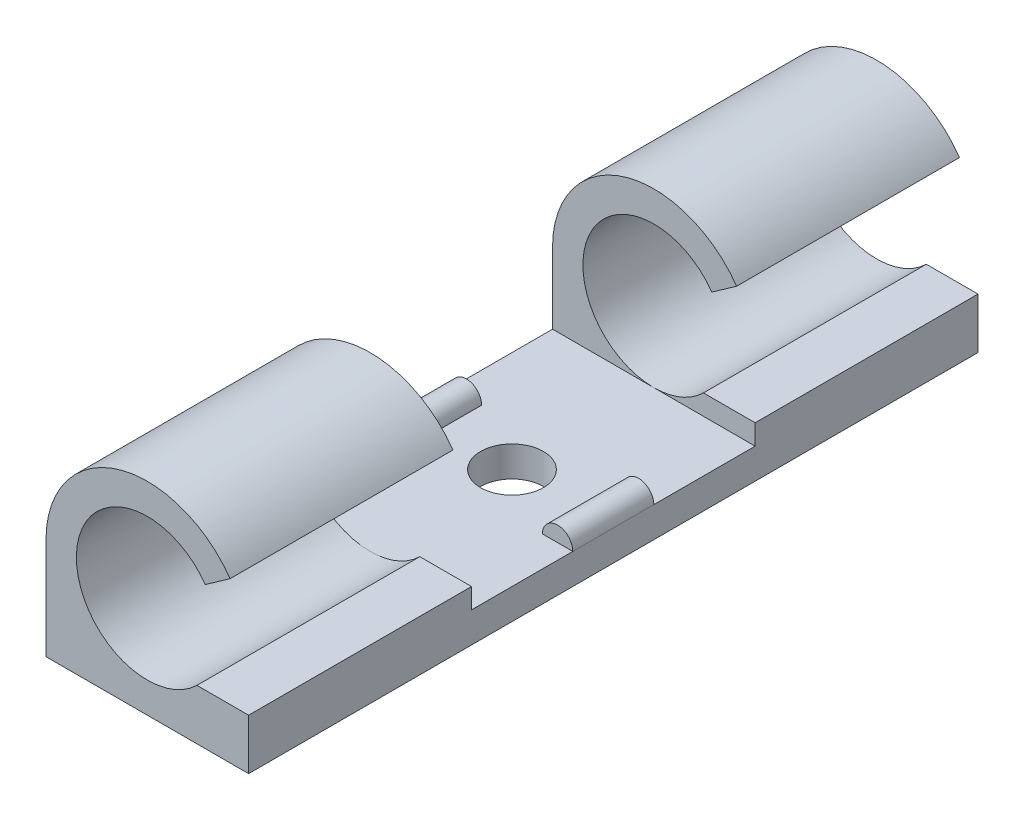
ISO-10303-21;
HEADER;
FILE_DESCRIPTION(('STEP AP214'),'2;1');
FILE_NAME('part.step','',(''),(''),'','','');
FILE_SCHEMA(('AUTOMOTIVE_DESIGN { 1 0 10303 214 1 1 1 1 }'));
ENDSEC;
DATA;
#1=APPLICATION_CONTEXT('core data for automotive mechanical design processes');
#2=APPLICATION_PROTOCOL_DEFINITION('international standard','automotive_design',2000,#1);
#3=PRODUCT_CONTEXT('',#1,'mechanical');
#4=PRODUCT('Part','Part','',(#3));
#5=PRODUCT_RELATED_PRODUCT_CATEGORY('part','',(#4));
#6=PRODUCT_DEFINITION_FORMATION('','',#4);
#7=PRODUCT_DEFINITION_CONTEXT('part definition',#1,'design');
#8=PRODUCT_DEFINITION('design','',#6,#7);
#9=PRODUCT_DEFINITION_SHAPE('','',#8);
#10=(LENGTH_UNIT() NAMED_UNIT(*) SI_UNIT(.MILLI.,.METRE.));
#11=(NAMED_UNIT(*) PLANE_ANGLE_UNIT() SI_UNIT($,.RADIAN.));
#12=(NAMED_UNIT(*) SI_UNIT($,.STERADIAN.) SOLID_ANGLE_UNIT());
#13=UNCERTAINTY_MEASURE_WITH_UNIT(LENGTH_MEASURE(1.E-05),#10,'distance_accuracy_value','');
#14=(GEOMETRIC_REPRESENTATION_CONTEXT(3) GLOBAL_UNCERTAINTY_ASSIGNED_CONTEXT((#13)) GLOBAL_UNIT_ASSIGNED_CONTEXT((#10,
#11,#12)) REPRESENTATION_CONTEXT('',''));
#15=CARTESIAN_POINT('',(0.,0.,0.));
#16=DIRECTION('',(0.,0.,1.));
#17=DIRECTION('',(1.,0.,0.));
#18=AXIS2_PLACEMENT_3D('',#15,#16,#17);
#19=CARTESIAN_POINT('',(5.,0.,11.));
#20=DIRECTION('',(1.,0.,0.));
#21=DIRECTION('',(0.,0.,-1.));
#22=AXIS2_PLACEMENT_3D('',#19,#20,#21);
#23=PLANE('',#22);
#24=DIRECTION('',(0.,-1.,0.));
#25=VECTOR('',#24,1.);
#26=CARTESIAN_POINT('',(5.,0.,0.));
#27=LINE('',#26,#25);
#28=CARTESIAN_POINT('',(5.,-2.5,0.));
#29=VERTEX_POINT('',#28);
#30=CARTESIAN_POINT('',(5.,-5.,0.));
#31=VERTEX_POINT('',#30);
#32=EDGE_CURVE('E200',#29,#31,#27,.T.);
#33=ORIENTED_EDGE('',*,*,#32,.F.);
#34=DIRECTION('',(0.,0.,1.));
#35=VECTOR('',#34,1.);
#36=CARTESIAN_POINT('',(5.,-2.5,0.));
#37=LINE('',#36,#35);
#38=CARTESIAN_POINT('',(5.,-2.5,11.));
#39=VERTEX_POINT('',#38);
#40=EDGE_CURVE('E61',#29,#39,#37,.T.);
#41=ORIENTED_EDGE('',*,*,#40,.T.);
#42=DIRECTION('',(0.,-1.,0.));
#43=VECTOR('',#42,1.);
#44=CARTESIAN_POINT('',(5.,0.,11.));
#45=LINE('',#44,#43);
#46=CARTESIAN_POINT('',(5.,-3.5,11.));
#47=VERTEX_POINT('',#46);
#48=EDGE_CURVE('E330',#39,#47,#45,.T.);
#49=ORIENTED_EDGE('',*,*,#48,.T.);
#50=DIRECTION('',(0.,0.,-1.));
#51=VECTOR('',#50,1.);
#52=CARTESIAN_POINT('',(5.,-3.5,18.));
#53=LINE('',#52,#51);
#54=CARTESIAN_POINT('',(5.,-3.5,16.));
#55=VERTEX_POINT('',#54);
#56=EDGE_CURVE('E202',#55,#47,#53,.T.);
#57=ORIENTED_EDGE('',*,*,#56,.F.);
#58=CARTESIAN_POINT('',(5.,-3.5,20.));
#59=VERTEX_POINT('',#58);
#60=EDGE_CURVE('E197',#59,#55,#53,.T.);
#61=ORIENTED_EDGE('',*,*,#60,.F.);
#62=DIRECTION('',(0.,0.,1.));
#63=VECTOR('',#62,1.);
#64=CARTESIAN_POINT('',(5.,-3.5,18.));
#65=LINE('',#64,#63);
#66=CARTESIAN_POINT('',(5.,-3.5,25.));
#67=VERTEX_POINT('',#66);
#68=EDGE_CURVE('E285',#59,#67,#65,.T.);
#69=ORIENTED_EDGE('',*,*,#68,.T.);
#70=DIRECTION('',(0.,-1.,0.));
#71=VECTOR('',#70,1.);
#72=CARTESIAN_POINT('',(5.,0.,25.));
#73=LINE('',#72,#71);
#74=CARTESIAN_POINT('',(5.,-2.5,25.));
#75=VERTEX_POINT('',#74);
#76=EDGE_CURVE('E292',#75,#67,#73,.T.);
#77=ORIENTED_EDGE('',*,*,#76,.F.);
#78=CARTESIAN_POINT('',(5.,-2.5,36.));
#79=VERTEX_POINT('',#78);
#80=EDGE_CURVE('E191',#75,#79,#37,.T.);
#81=ORIENTED_EDGE('',*,*,#80,.T.);
#82=DIRECTION('',(0.,-1.,0.));
#83=VECTOR('',#82,1.);
#84=CARTESIAN_POINT('',(5.,0.,36.));
#85=LINE('',#84,#83);
#86=CARTESIAN_POINT('',(5.,-5.,36.));
#87=VERTEX_POINT('',#86);
#88=EDGE_CURVE('E224',#79,#87,#85,.T.);
#89=ORIENTED_EDGE('',*,*,#88,.T.);
#90=DIRECTION('',(0.,0.,-1.));
#91=VECTOR('',#90,1.);
#92=CARTESIAN_POINT('',(5.,-5.,11.));
#93=LINE('',#92,#91);
#94=EDGE_CURVE('E52',#87,#31,#93,.T.);
#95=ORIENTED_EDGE('',*,*,#94,.T.);
#96=EDGE_LOOP('',(#33,#41,#49,#57,#61,#69,#77,#81,#89,#95));
#97=FACE_BOUND('',#96,.T.);
#98=ADVANCED_FACE('F43',(#97),#23,.T.);
#99=CARTESIAN_POINT('',(0.,0.,11.));
#100=DIRECTION('',(0.,0.,-1.));
#101=DIRECTION('',(-1.,0.,0.));
#102=AXIS2_PLACEMENT_3D('',#99,#100,#101);
#103=CYLINDRICAL_SURFACE('',#102,5.);
#104=DIRECTION('',(0.,0.,1.));
#105=VECTOR('',#104,1.);
#106=CARTESIAN_POINT('',(4.08754779922108,2.87957514037798,0.));
#107=LINE('',#106,#105);
#108=CARTESIAN_POINT('',(4.08754779922108,2.87957514037798,0.));
#109=VERTEX_POINT('',#108);
#110=CARTESIAN_POINT('',(4.08754779922108,2.87957514037798,11.));
#111=VERTEX_POINT('',#110);
#112=EDGE_CURVE('E243',#109,#111,#107,.T.);
#113=ORIENTED_EDGE('',*,*,#112,.F.);
#114=CARTESIAN_POINT('',(0.,0.,0.));
#115=DIRECTION('',(0.,0.,1.));
#116=DIRECTION('',(1.,0.,0.));
#117=AXIS2_PLACEMENT_3D('',#114,#115,#116);
#118=CIRCLE('',#117,5.);
#119=CARTESIAN_POINT('',(-5.,0.,0.));
#120=VERTEX_POINT('',#119);
#121=EDGE_CURVE('E209',#109,#120,#118,.T.);
#122=ORIENTED_EDGE('',*,*,#121,.T.);
#123=DIRECTION('',(0.,0.,-1.));
#124=VECTOR('',#123,1.);
#125=CARTESIAN_POINT('',(-5.,0.,11.));
#126=LINE('',#125,#124);
#127=CARTESIAN_POINT('',(-5.,0.,11.));
#128=VERTEX_POINT('',#127);
#129=EDGE_CURVE('E217',#128,#120,#126,.T.);
#130=ORIENTED_EDGE('',*,*,#129,.F.);
#131=CARTESIAN_POINT('',(0.,0.,11.));
#132=DIRECTION('',(0.,0.,1.));
#133=DIRECTION('',(1.,0.,0.));
#134=AXIS2_PLACEMENT_3D('',#131,#132,#133);
#135=CIRCLE('',#134,5.);
#136=EDGE_CURVE('E242',#111,#128,#135,.T.);
#137=ORIENTED_EDGE('',*,*,#136,.F.);
#138=EDGE_LOOP('',(#113,#122,#130,#137));
#139=FACE_BOUND('',#138,.T.);
#140=ADVANCED_FACE('F241',(#139),#103,.T.);
#141=CARTESIAN_POINT('',(0.,0.,11.));
#142=DIRECTION('',(0.,0.,-1.));
#143=DIRECTION('',(-1.,0.,0.));
#144=AXIS2_PLACEMENT_3D('',#141,#142,#143);
#145=CYLINDRICAL_SURFACE('',#144,3.5);
#146=CARTESIAN_POINT('',(0.,0.,0.));
#147=DIRECTION('',(0.,0.,1.));
#148=DIRECTION('',(1.,0.,0.));
#149=AXIS2_PLACEMENT_3D('',#146,#147,#148);
#150=CIRCLE('',#149,3.5);
#151=CARTESIAN_POINT('',(2.86128345945476,2.01570259826459,0.));
#152=VERTEX_POINT('',#151);
#153=CARTESIAN_POINT('',(2.44948974278318,-2.5,0.));
#154=VERTEX_POINT('',#153);
#155=EDGE_CURVE('E188',#152,#154,#150,.T.);
#156=ORIENTED_EDGE('',*,*,#155,.F.);
#157=DIRECTION('',(0.,0.,1.));
#158=VECTOR('',#157,1.);
#159=CARTESIAN_POINT('',(2.86128345945476,2.01570259826459,0.));
#160=LINE('',#159,#158);
#161=CARTESIAN_POINT('',(2.86128345945476,2.01570259826459,11.));
#162=VERTEX_POINT('',#161);
#163=EDGE_CURVE('E69',#152,#162,#160,.T.);
#164=ORIENTED_EDGE('',*,*,#163,.T.);
#165=CARTESIAN_POINT('',(0.,0.,11.));
#166=DIRECTION('',(0.,0.,1.));
#167=DIRECTION('',(1.,0.,0.));
#168=AXIS2_PLACEMENT_3D('',#165,#166,#167);
#169=CIRCLE('',#168,3.5);
#170=CARTESIAN_POINT('',(0.,-3.5,11.));
#171=VERTEX_POINT('',#170);
#172=EDGE_CURVE('E213',#162,#171,#169,.T.);
#173=ORIENTED_EDGE('',*,*,#172,.T.);
#174=CARTESIAN_POINT('',(2.44948974278318,-2.5,11.));
#175=VERTEX_POINT('',#174);
#176=EDGE_CURVE('E190',#171,#175,#169,.T.);
#177=ORIENTED_EDGE('',*,*,#176,.T.);
#178=DIRECTION('',(0.,0.,1.));
#179=VECTOR('',#178,1.);
#180=CARTESIAN_POINT('',(2.44948974278318,-2.5,0.));
#181=LINE('',#180,#179);
#182=EDGE_CURVE('E177',#154,#175,#181,.T.);
#183=ORIENTED_EDGE('',*,*,#182,.F.);
#184=EDGE_LOOP('',(#156,#164,#173,#177,#183));
#185=FACE_BOUND('',#184,.T.);
#186=ADVANCED_FACE('F45',(#185),#145,.F.);
#187=CARTESIAN_POINT('',(0.,0.,11.));
#188=DIRECTION('',(0.,0.,1.));
#189=DIRECTION('',(1.,0.,0.));
#190=AXIS2_PLACEMENT_3D('',#187,#188,#189);
#191=PLANE('',#190);
#192=ORIENTED_EDGE('',*,*,#172,.F.);
#193=DIRECTION('',(0.817509559844217,0.575915028075597,0.));
#194=VECTOR('',#193,1.);
#195=CARTESIAN_POINT('',(0.,0.,11.));
#196=LINE('',#195,#194);
#197=EDGE_CURVE('E261',#162,#111,#196,.T.);
#198=ORIENTED_EDGE('',*,*,#197,.T.);
#199=ORIENTED_EDGE('',*,*,#136,.T.);
#200=DIRECTION('',(0.,-1.,0.));
#201=VECTOR('',#200,1.);
#202=CARTESIAN_POINT('',(-5.,0.,11.));
#203=LINE('',#202,#201);
#204=CARTESIAN_POINT('',(-5.,-3.5,11.));
#205=VERTEX_POINT('',#204);
#206=EDGE_CURVE('E205',#128,#205,#203,.T.);
#207=ORIENTED_EDGE('',*,*,#206,.T.);
#208=DIRECTION('',(-1.,0.,0.));
#209=VECTOR('',#208,1.);
#210=CARTESIAN_POINT('',(-5.,-3.5,11.));
#211=LINE('',#210,#209);
#212=EDGE_CURVE('E11',#171,#205,#211,.T.);
#213=ORIENTED_EDGE('',*,*,#212,.F.);
#214=EDGE_LOOP('',(#192,#198,#199,#207,#213));
#215=FACE_BOUND('',#214,.T.);
#216=ADVANCED_FACE('F334',(#215),#191,.T.);
#217=ORIENTED_EDGE('',*,*,#48,.F.);
#218=DIRECTION('',(-1.,0.,0.));
#219=VECTOR('',#218,1.);
#220=CARTESIAN_POINT('',(0.,-2.5,11.));
#221=LINE('',#220,#219);
#222=EDGE_CURVE('E249',#39,#175,#221,.T.);
#223=ORIENTED_EDGE('',*,*,#222,.T.);
#224=ORIENTED_EDGE('',*,*,#176,.F.);
#225=EDGE_CURVE('E54',#47,#171,#211,.T.);
#226=ORIENTED_EDGE('',*,*,#225,.F.);
#227=EDGE_LOOP('',(#217,#223,#224,#226));
#228=FACE_BOUND('',#227,.T.);
#229=ADVANCED_FACE('F345',(#228),#191,.T.);
#230=CARTESIAN_POINT('',(0.,0.,0.));
#231=DIRECTION('',(0.,0.,1.));
#232=DIRECTION('',(1.,0.,0.));
#233=AXIS2_PLACEMENT_3D('',#230,#231,#232);
#234=PLANE('',#233);
#235=DIRECTION('',(0.817509559844217,0.575915028075597,0.));
#236=VECTOR('',#235,1.);
#237=CARTESIAN_POINT('',(0.,0.,0.));
#238=LINE('',#237,#236);
#239=EDGE_CURVE('E183',#152,#109,#238,.T.);
#240=ORIENTED_EDGE('',*,*,#239,.F.);
#241=ORIENTED_EDGE('',*,*,#155,.T.);
#242=DIRECTION('',(-1.,0.,0.));
#243=VECTOR('',#242,1.);
#244=CARTESIAN_POINT('',(0.,-2.5,0.));
#245=LINE('',#244,#243);
#246=EDGE_CURVE('E174',#29,#154,#245,.T.);
#247=ORIENTED_EDGE('',*,*,#246,.F.);
#248=ORIENTED_EDGE('',*,*,#32,.T.);
#249=DIRECTION('',(1.,0.,0.));
#250=VECTOR('',#249,1.);
#251=CARTESIAN_POINT('',(0.,-5.,0.));
#252=LINE('',#251,#250);
#253=CARTESIAN_POINT('',(-5.,-5.,0.));
#254=VERTEX_POINT('',#253);
#255=EDGE_CURVE('E196',#254,#31,#252,.T.);
#256=ORIENTED_EDGE('',*,*,#255,.F.);
#257=DIRECTION('',(0.,-1.,0.));
#258=VECTOR('',#257,1.);
#259=CARTESIAN_POINT('',(-5.,0.,0.));
#260=LINE('',#259,#258);
#261=EDGE_CURVE('E211',#120,#254,#260,.T.);
#262=ORIENTED_EDGE('',*,*,#261,.F.);
#263=ORIENTED_EDGE('',*,*,#121,.F.);
#264=EDGE_LOOP('',(#240,#241,#247,#248,#256,#262,#263));
#265=FACE_BOUND('',#264,.T.);
#266=ADVANCED_FACE('F194',(#265),#234,.F.);
#267=CARTESIAN_POINT('',(0.,0.,25.));
#268=DIRECTION('',(0.,0.,1.));
#269=DIRECTION('',(-1.,0.,0.));
#270=AXIS2_PLACEMENT_3D('',#267,#268,#269);
#271=CYLINDRICAL_SURFACE('',#270,5.);
#272=CARTESIAN_POINT('',(4.08754779922108,2.87957514037798,25.));
#273=VERTEX_POINT('',#272);
#274=CARTESIAN_POINT('',(4.08754779922108,2.87957514037798,36.));
#275=VERTEX_POINT('',#274);
#276=EDGE_CURVE('E246',#273,#275,#107,.T.);
#277=ORIENTED_EDGE('',*,*,#276,.F.);
#278=CARTESIAN_POINT('',(0.,0.,25.));
#279=DIRECTION('',(0.,0.,1.));
#280=DIRECTION('',(1.,0.,0.));
#281=AXIS2_PLACEMENT_3D('',#278,#279,#280);
#282=CIRCLE('',#281,5.);
#283=CARTESIAN_POINT('',(-5.,0.,25.));
#284=VERTEX_POINT('',#283);
#285=EDGE_CURVE('E295',#273,#284,#282,.T.);
#286=ORIENTED_EDGE('',*,*,#285,.T.);
#287=DIRECTION('',(0.,0.,1.));
#288=VECTOR('',#287,1.);
#289=CARTESIAN_POINT('',(-5.,0.,25.));
#290=LINE('',#289,#288);
#291=CARTESIAN_POINT('',(-5.,0.,36.));
#292=VERTEX_POINT('',#291);
#293=EDGE_CURVE('E299',#284,#292,#290,.T.);
#294=ORIENTED_EDGE('',*,*,#293,.T.);
#295=CARTESIAN_POINT('',(0.,0.,36.));
#296=DIRECTION('',(0.,0.,1.));
#297=DIRECTION('',(1.,0.,0.));
#298=AXIS2_PLACEMENT_3D('',#295,#296,#297);
#299=CIRCLE('',#298,5.);
#300=EDGE_CURVE('E305',#275,#292,#299,.T.);
#301=ORIENTED_EDGE('',*,*,#300,.F.);
#302=EDGE_LOOP('',(#277,#286,#294,#301));
#303=FACE_BOUND('',#302,.T.);
#304=ADVANCED_FACE('F372',(#303),#271,.T.);
#305=CARTESIAN_POINT('',(0.,0.,25.));
#306=DIRECTION('',(0.,0.,1.));
#307=DIRECTION('',(-1.,0.,0.));
#308=AXIS2_PLACEMENT_3D('',#305,#306,#307);
#309=CYLINDRICAL_SURFACE('',#308,3.5);
#310=CARTESIAN_POINT('',(0.,0.,25.));
#311=DIRECTION('',(0.,0.,1.));
#312=DIRECTION('',(1.,0.,0.));
#313=AXIS2_PLACEMENT_3D('',#310,#311,#312);
#314=CIRCLE('',#313,3.5);
#315=CARTESIAN_POINT('',(2.86128345945476,2.01570259826459,25.));
#316=VERTEX_POINT('',#315);
#317=CARTESIAN_POINT('',(0.,-3.5,25.));
#318=VERTEX_POINT('',#317);
#319=EDGE_CURVE('E293',#316,#318,#314,.T.);
#320=ORIENTED_EDGE('',*,*,#319,.F.);
#321=CARTESIAN_POINT('',(2.86128345945476,2.01570259826459,36.));
#322=VERTEX_POINT('',#321);
#323=EDGE_CURVE('E182',#316,#322,#160,.T.);
#324=ORIENTED_EDGE('',*,*,#323,.T.);
#325=CARTESIAN_POINT('',(0.,0.,36.));
#326=DIRECTION('',(0.,0.,1.));
#327=DIRECTION('',(1.,0.,0.));
#328=AXIS2_PLACEMENT_3D('',#325,#326,#327);
#329=CIRCLE('',#328,3.5);
#330=CARTESIAN_POINT('',(2.44948974278318,-2.5,36.));
#331=VERTEX_POINT('',#330);
#332=EDGE_CURVE('E288',#322,#331,#329,.T.);
#333=ORIENTED_EDGE('',*,*,#332,.T.);
#334=CARTESIAN_POINT('',(2.44948974278318,-2.5,25.));
#335=VERTEX_POINT('',#334);
#336=EDGE_CURVE('E192',#335,#331,#181,.T.);
#337=ORIENTED_EDGE('',*,*,#336,.F.);
#338=EDGE_CURVE('E289',#318,#335,#314,.T.);
#339=ORIENTED_EDGE('',*,*,#338,.F.);
#340=EDGE_LOOP('',(#320,#324,#333,#337,#339));
#341=FACE_BOUND('',#340,.T.);
#342=ADVANCED_FACE('F434',(#341),#309,.F.);
#343=CARTESIAN_POINT('',(0.,0.,25.));
#344=DIRECTION('',(0.,0.,-1.));
#345=DIRECTION('',(1.,0.,0.));
#346=AXIS2_PLACEMENT_3D('',#343,#344,#345);
#347=PLANE('',#346);
#348=ORIENTED_EDGE('',*,*,#285,.F.);
#349=DIRECTION('',(-0.817509559844217,-0.575915028075597,0.));
#350=VECTOR('',#349,1.);
#351=CARTESIAN_POINT('',(0.,0.,25.));
#352=LINE('',#351,#350);
#353=EDGE_CURVE('E258',#273,#316,#352,.T.);
#354=ORIENTED_EDGE('',*,*,#353,.T.);
#355=ORIENTED_EDGE('',*,*,#319,.T.);
#356=DIRECTION('',(-1.,0.,0.));
#357=VECTOR('',#356,1.);
#358=CARTESIAN_POINT('',(-5.,-3.5,25.));
#359=LINE('',#358,#357);
#360=CARTESIAN_POINT('',(-5.,-3.5,25.));
#361=VERTEX_POINT('',#360);
#362=EDGE_CURVE('E282',#318,#361,#359,.T.);
#363=ORIENTED_EDGE('',*,*,#362,.T.);
#364=DIRECTION('',(0.,-1.,0.));
#365=VECTOR('',#364,1.);
#366=CARTESIAN_POINT('',(-5.,0.,25.));
#367=LINE('',#366,#365);
#368=EDGE_CURVE('E297',#284,#361,#367,.T.);
#369=ORIENTED_EDGE('',*,*,#368,.F.);
#370=EDGE_LOOP('',(#348,#354,#355,#363,#369));
#371=FACE_BOUND('',#370,.T.);
#372=ADVANCED_FACE('F376',(#371),#347,.T.);
#373=ORIENTED_EDGE('',*,*,#338,.T.);
#374=DIRECTION('',(1.,0.,0.));
#375=VECTOR('',#374,1.);
#376=CARTESIAN_POINT('',(0.,-2.5,25.));
#377=LINE('',#376,#375);
#378=EDGE_CURVE('E245',#335,#75,#377,.T.);
#379=ORIENTED_EDGE('',*,*,#378,.T.);
#380=ORIENTED_EDGE('',*,*,#76,.T.);
#381=EDGE_CURVE('E273',#67,#318,#359,.T.);
#382=ORIENTED_EDGE('',*,*,#381,.T.);
#383=EDGE_LOOP('',(#373,#379,#380,#382));
#384=FACE_BOUND('',#383,.T.);
#385=ADVANCED_FACE('F360',(#384),#347,.T.);
#386=CARTESIAN_POINT('',(0.,0.,36.));
#387=DIRECTION('',(0.,0.,-1.));
#388=DIRECTION('',(1.,0.,0.));
#389=AXIS2_PLACEMENT_3D('',#386,#387,#388);
#390=PLANE('',#389);
#391=DIRECTION('',(0.817509559844217,0.575915028075597,0.));
#392=VECTOR('',#391,1.);
#393=CARTESIAN_POINT('',(0.,0.,36.));
#394=LINE('',#393,#392);
#395=EDGE_CURVE('E608',#322,#275,#394,.T.);
#396=ORIENTED_EDGE('',*,*,#395,.T.);
#397=ORIENTED_EDGE('',*,*,#300,.T.);
#398=DIRECTION('',(0.,-1.,0.));
#399=VECTOR('',#398,1.);
#400=CARTESIAN_POINT('',(-5.,0.,36.));
#401=LINE('',#400,#399);
#402=CARTESIAN_POINT('',(-5.,-5.,36.));
#403=VERTEX_POINT('',#402);
#404=EDGE_CURVE('E307',#292,#403,#401,.T.);
#405=ORIENTED_EDGE('',*,*,#404,.T.);
#406=DIRECTION('',(1.,0.,0.));
#407=VECTOR('',#406,1.);
#408=CARTESIAN_POINT('',(0.,-5.,36.));
#409=LINE('',#408,#407);
#410=EDGE_CURVE('E302',#403,#87,#409,.T.);
#411=ORIENTED_EDGE('',*,*,#410,.T.);
#412=ORIENTED_EDGE('',*,*,#88,.F.);
#413=DIRECTION('',(-1.,0.,0.));
#414=VECTOR('',#413,1.);
#415=CARTESIAN_POINT('',(0.,-2.5,36.));
#416=LINE('',#415,#414);
#417=EDGE_CURVE('E253',#79,#331,#416,.T.);
#418=ORIENTED_EDGE('',*,*,#417,.T.);
#419=ORIENTED_EDGE('',*,*,#332,.F.);
#420=EDGE_LOOP('',(#396,#397,#405,#411,#412,#418,#419));
#421=FACE_BOUND('',#420,.T.);
#422=ADVANCED_FACE('F366',(#421),#390,.F.);
#423=CARTESIAN_POINT('',(-5.,-3.5,18.));
#424=DIRECTION('',(0.,-1.,0.));
#425=DIRECTION('',(0.,0.,-1.));
#426=AXIS2_PLACEMENT_3D('',#423,#424,#425);
#427=PLANE('',#426);
#428=CARTESIAN_POINT('',(0.,-3.5,18.));
#429=DIRECTION('',(0.,1.,0.));
#430=DIRECTION('',(0.,0.,1.));
#431=AXIS2_PLACEMENT_3D('',#428,#429,#430);
#432=CIRCLE('',#431,1.55);
#433=CARTESIAN_POINT('',(0.,-3.5,19.55));
#434=VERTEX_POINT('',#433);
#435=EDGE_CURVE('E263',#434,#434,#432,.T.);
#436=ORIENTED_EDGE('',*,*,#435,.F.);
#437=EDGE_LOOP('',(#436));
#438=FACE_BOUND('',#437,.T.);
#439=DIRECTION('',(0.,0.,1.));
#440=VECTOR('',#439,1.);
#441=CARTESIAN_POINT('',(-3.5,-3.5,16.));
#442=LINE('',#441,#440);
#443=CARTESIAN_POINT('',(-3.5,-3.5,16.));
#444=VERTEX_POINT('',#443);
#445=CARTESIAN_POINT('',(-3.5,-3.5,20.));
#446=VERTEX_POINT('',#445);
#447=EDGE_CURVE('E314',#444,#446,#442,.T.);
#448=ORIENTED_EDGE('',*,*,#447,.T.);
#449=DIRECTION('',(-1.,0.,0.));
#450=VECTOR('',#449,1.);
#451=CARTESIAN_POINT('',(0.,-3.5,20.));
#452=LINE('',#451,#450);
#453=CARTESIAN_POINT('',(-5.,-3.5,20.));
#454=VERTEX_POINT('',#453);
#455=EDGE_CURVE('E270',#446,#454,#452,.T.);
#456=ORIENTED_EDGE('',*,*,#455,.T.);
#457=DIRECTION('',(0.,0.,1.));
#458=VECTOR('',#457,1.);
#459=CARTESIAN_POINT('',(-5.,-3.5,18.));
#460=LINE('',#459,#458);
#461=EDGE_CURVE('E281',#454,#361,#460,.T.);
#462=ORIENTED_EDGE('',*,*,#461,.T.);
#463=ORIENTED_EDGE('',*,*,#362,.F.);
#464=ORIENTED_EDGE('',*,*,#381,.F.);
#465=ORIENTED_EDGE('',*,*,#68,.F.);
#466=DIRECTION('',(-1.,0.,0.));
#467=VECTOR('',#466,1.);
#468=CARTESIAN_POINT('',(0.,-3.5,20.));
#469=LINE('',#468,#467);
#470=CARTESIAN_POINT('',(3.5,-3.5,20.));
#471=VERTEX_POINT('',#470);
#472=EDGE_CURVE('E266',#59,#471,#469,.T.);
#473=ORIENTED_EDGE('',*,*,#472,.T.);
#474=DIRECTION('',(0.,0.,1.));
#475=VECTOR('',#474,1.);
#476=CARTESIAN_POINT('',(3.5,-3.5,16.));
#477=LINE('',#476,#475);
#478=CARTESIAN_POINT('',(3.5,-3.5,16.));
#479=VERTEX_POINT('',#478);
#480=EDGE_CURVE('E317',#479,#471,#477,.T.);
#481=ORIENTED_EDGE('',*,*,#480,.F.);
#482=DIRECTION('',(-1.,0.,0.));
#483=VECTOR('',#482,1.);
#484=CARTESIAN_POINT('',(0.,-3.5,16.));
#485=LINE('',#484,#483);
#486=EDGE_CURVE('E311',#55,#479,#485,.T.);
#487=ORIENTED_EDGE('',*,*,#486,.F.);
#488=ORIENTED_EDGE('',*,*,#56,.T.);
#489=ORIENTED_EDGE('',*,*,#225,.T.);
#490=ORIENTED_EDGE('',*,*,#212,.T.);
#491=DIRECTION('',(0.,0.,-1.));
#492=VECTOR('',#491,1.);
#493=CARTESIAN_POINT('',(-5.,-3.5,18.));
#494=LINE('',#493,#492);
#495=CARTESIAN_POINT('',(-5.,-3.5,16.));
#496=VERTEX_POINT('',#495);
#497=EDGE_CURVE('E325',#496,#205,#494,.T.);
#498=ORIENTED_EDGE('',*,*,#497,.F.);
#499=DIRECTION('',(-1.,0.,0.));
#500=VECTOR('',#499,1.);
#501=CARTESIAN_POINT('',(0.,-3.5,16.));
#502=LINE('',#501,#500);
#503=EDGE_CURVE('E321',#444,#496,#502,.T.);
#504=ORIENTED_EDGE('',*,*,#503,.F.);
#505=EDGE_LOOP('',(#448,#456,#462,#463,#464,#465,#473,#481,#487,#488,#489,#490,#498,#504));
#506=FACE_BOUND('',#505,.T.);
#507=ADVANCED_FACE('F337',(#438,#506),#427,.F.);
#508=CARTESIAN_POINT('',(0.,-5.,11.));
#509=DIRECTION('',(0.,1.,0.));
#510=DIRECTION('',(0.,0.,1.));
#511=AXIS2_PLACEMENT_3D('',#508,#509,#510);
#512=PLANE('',#511);
#513=CARTESIAN_POINT('',(0.,-5.,18.));
#514=DIRECTION('',(0.,1.,0.));
#515=DIRECTION('',(0.,0.,1.));
#516=AXIS2_PLACEMENT_3D('',#513,#514,#515);
#517=CIRCLE('',#516,1.55);
#518=CARTESIAN_POINT('',(0.,-5.,19.55));
#519=VERTEX_POINT('',#518);
#520=EDGE_CURVE('E47',#519,#519,#517,.T.);
#521=ORIENTED_EDGE('',*,*,#520,.T.);
#522=EDGE_LOOP('',(#521));
#523=FACE_BOUND('',#522,.T.);
#524=ORIENTED_EDGE('',*,*,#255,.T.);
#525=ORIENTED_EDGE('',*,*,#94,.F.);
#526=ORIENTED_EDGE('',*,*,#410,.F.);
#527=DIRECTION('',(0.,0.,-1.));
#528=VECTOR('',#527,1.);
#529=CARTESIAN_POINT('',(-5.,-5.,11.));
#530=LINE('',#529,#528);
#531=EDGE_CURVE('E214',#403,#254,#530,.T.);
#532=ORIENTED_EDGE('',*,*,#531,.T.);
#533=EDGE_LOOP('',(#524,#525,#526,#532));
#534=FACE_BOUND('',#533,.T.);
#535=ADVANCED_FACE('F229',(#523,#534),#512,.F.);
#536=CARTESIAN_POINT('',(-5.,0.,11.));
#537=DIRECTION('',(1.,0.,0.));
#538=DIRECTION('',(0.,0.,-1.));
#539=AXIS2_PLACEMENT_3D('',#536,#537,#538);
#540=PLANE('',#539);
#541=ORIENTED_EDGE('',*,*,#261,.T.);
#542=ORIENTED_EDGE('',*,*,#531,.F.);
#543=ORIENTED_EDGE('',*,*,#404,.F.);
#544=ORIENTED_EDGE('',*,*,#293,.F.);
#545=ORIENTED_EDGE('',*,*,#368,.T.);
#546=ORIENTED_EDGE('',*,*,#461,.F.);
#547=EDGE_CURVE('E326',#454,#496,#494,.T.);
#548=ORIENTED_EDGE('',*,*,#547,.T.);
#549=ORIENTED_EDGE('',*,*,#497,.T.);
#550=ORIENTED_EDGE('',*,*,#206,.F.);
#551=ORIENTED_EDGE('',*,*,#129,.T.);
#552=EDGE_LOOP('',(#541,#542,#543,#544,#545,#546,#548,#549,#550,#551));
#553=FACE_BOUND('',#552,.T.);
#554=ADVANCED_FACE('F232',(#553),#540,.F.);
#555=CARTESIAN_POINT('',(-4.25,-3.5,16.));
#556=DIRECTION('',(0.,0.,1.));
#557=DIRECTION('',(1.,0.,0.));
#558=AXIS2_PLACEMENT_3D('',#555,#556,#557);
#559=CYLINDRICAL_SURFACE('',#558,0.75);
#560=ORIENTED_EDGE('',*,*,#547,.F.);
#561=CARTESIAN_POINT('',(-4.25,-3.5,20.));
#562=DIRECTION('',(0.,0.,1.));
#563=DIRECTION('',(1.,0.,0.));
#564=AXIS2_PLACEMENT_3D('',#561,#562,#563);
#565=CIRCLE('',#564,0.75);
#566=EDGE_CURVE('E274',#454,#446,#565,.F.);
#567=ORIENTED_EDGE('',*,*,#566,.T.);
#568=ORIENTED_EDGE('',*,*,#447,.F.);
#569=CARTESIAN_POINT('',(-4.25,-3.5,16.));
#570=DIRECTION('',(0.,0.,1.));
#571=DIRECTION('',(1.,0.,0.));
#572=AXIS2_PLACEMENT_3D('',#569,#570,#571);
#573=CIRCLE('',#572,0.75);
#574=EDGE_CURVE('E319',#496,#444,#573,.F.);
#575=ORIENTED_EDGE('',*,*,#574,.F.);
#576=EDGE_LOOP('',(#560,#567,#568,#575));
#577=FACE_BOUND('',#576,.T.);
#578=ADVANCED_FACE('F384',(#577),#559,.T.);
#579=CARTESIAN_POINT('',(0.,0.,16.));
#580=DIRECTION('',(0.,0.,1.));
#581=DIRECTION('',(1.,0.,0.));
#582=AXIS2_PLACEMENT_3D('',#579,#580,#581);
#583=PLANE('',#582);
#584=ORIENTED_EDGE('',*,*,#574,.T.);
#585=ORIENTED_EDGE('',*,*,#503,.T.);
#586=EDGE_LOOP('',(#584,#585));
#587=FACE_BOUND('',#586,.T.);
#588=ADVANCED_FACE('F387',(#587),#583,.F.);
#589=CARTESIAN_POINT('',(4.25,-3.5,16.));
#590=DIRECTION('',(0.,0.,1.));
#591=DIRECTION('',(1.,0.,0.));
#592=AXIS2_PLACEMENT_3D('',#589,#590,#591);
#593=CYLINDRICAL_SURFACE('',#592,0.75);
#594=ORIENTED_EDGE('',*,*,#480,.T.);
#595=CARTESIAN_POINT('',(4.25,-3.5,20.));
#596=DIRECTION('',(0.,0.,1.));
#597=DIRECTION('',(1.,0.,0.));
#598=AXIS2_PLACEMENT_3D('',#595,#596,#597);
#599=CIRCLE('',#598,0.75);
#600=EDGE_CURVE('E269',#59,#471,#599,.T.);
#601=ORIENTED_EDGE('',*,*,#600,.F.);
#602=ORIENTED_EDGE('',*,*,#60,.T.);
#603=CARTESIAN_POINT('',(4.25,-3.5,16.));
#604=DIRECTION('',(0.,0.,1.));
#605=DIRECTION('',(1.,0.,0.));
#606=AXIS2_PLACEMENT_3D('',#603,#604,#605);
#607=CIRCLE('',#606,0.75);
#608=EDGE_CURVE('E313',#55,#479,#607,.T.);
#609=ORIENTED_EDGE('',*,*,#608,.T.);
#610=EDGE_LOOP('',(#594,#601,#602,#609));
#611=FACE_BOUND('',#610,.T.);
#612=ADVANCED_FACE('F353',(#611),#593,.T.);
#613=CARTESIAN_POINT('',(0.,0.,16.));
#614=DIRECTION('',(0.,0.,1.));
#615=DIRECTION('',(1.,0.,0.));
#616=AXIS2_PLACEMENT_3D('',#613,#614,#615);
#617=PLANE('',#616);
#618=ORIENTED_EDGE('',*,*,#486,.T.);
#619=ORIENTED_EDGE('',*,*,#608,.F.);
#620=EDGE_LOOP('',(#618,#619));
#621=FACE_BOUND('',#620,.T.);
#622=ADVANCED_FACE('F394',(#621),#617,.F.);
#623=CARTESIAN_POINT('',(0.,0.,20.));
#624=DIRECTION('',(0.,0.,-1.));
#625=DIRECTION('',(1.,0.,0.));
#626=AXIS2_PLACEMENT_3D('',#623,#624,#625);
#627=PLANE('',#626);
#628=ORIENTED_EDGE('',*,*,#566,.F.);
#629=ORIENTED_EDGE('',*,*,#455,.F.);
#630=EDGE_LOOP('',(#628,#629));
#631=FACE_BOUND('',#630,.T.);
#632=ADVANCED_FACE('F382',(#631),#627,.F.);
#633=CARTESIAN_POINT('',(0.,0.,20.));
#634=DIRECTION('',(0.,0.,-1.));
#635=DIRECTION('',(1.,0.,0.));
#636=AXIS2_PLACEMENT_3D('',#633,#634,#635);
#637=PLANE('',#636);
#638=ORIENTED_EDGE('',*,*,#472,.F.);
#639=ORIENTED_EDGE('',*,*,#600,.T.);
#640=EDGE_LOOP('',(#638,#639));
#641=FACE_BOUND('',#640,.T.);
#642=ADVANCED_FACE('F356',(#641),#637,.F.);
#643=CARTESIAN_POINT('',(0.,-5.5,18.));
#644=DIRECTION('',(0.,1.,0.));
#645=DIRECTION('',(0.,0.,1.));
#646=AXIS2_PLACEMENT_3D('',#643,#644,#645);
#647=CYLINDRICAL_SURFACE('',#646,1.55);
#648=ORIENTED_EDGE('',*,*,#435,.T.);
#649=EDGE_LOOP('',(#648));
#650=FACE_BOUND('',#649,.T.);
#651=ORIENTED_EDGE('',*,*,#520,.F.);
#652=EDGE_LOOP('',(#651));
#653=FACE_BOUND('',#652,.T.);
#654=ADVANCED_FACE('F417',(#650,#653),#647,.F.);
#655=CARTESIAN_POINT('',(0.,-2.5,0.));
#656=DIRECTION('',(0.,1.,0.));
#657=DIRECTION('',(-1.,0.,0.));
#658=AXIS2_PLACEMENT_3D('',#655,#656,#657);
#659=PLANE('',#658);
#660=ORIENTED_EDGE('',*,*,#336,.T.);
#661=ORIENTED_EDGE('',*,*,#417,.F.);
#662=ORIENTED_EDGE('',*,*,#80,.F.);
#663=ORIENTED_EDGE('',*,*,#378,.F.);
#664=EDGE_LOOP('',(#660,#661,#662,#663));
#665=FACE_BOUND('',#664,.T.);
#666=ADVANCED_FACE('F418',(#665),#659,.T.);
#667=CARTESIAN_POINT('',(0.,0.,0.));
#668=DIRECTION('',(0.575915028075597,-0.817509559844216,0.));
#669=DIRECTION('',(0.817509559844217,0.575915028075597,0.));
#670=AXIS2_PLACEMENT_3D('',#667,#668,#669);
#671=PLANE('',#670);
#672=ORIENTED_EDGE('',*,*,#276,.T.);
#673=ORIENTED_EDGE('',*,*,#395,.F.);
#674=ORIENTED_EDGE('',*,*,#323,.F.);
#675=ORIENTED_EDGE('',*,*,#353,.F.);
#676=EDGE_LOOP('',(#672,#673,#674,#675));
#677=FACE_BOUND('',#676,.T.);
#678=ADVANCED_FACE('F424',(#677),#671,.T.);
#679=ORIENTED_EDGE('',*,*,#40,.F.);
#680=ORIENTED_EDGE('',*,*,#246,.T.);
#681=ORIENTED_EDGE('',*,*,#182,.T.);
#682=ORIENTED_EDGE('',*,*,#222,.F.);
#683=EDGE_LOOP('',(#679,#680,#681,#682));
#684=FACE_BOUND('',#683,.T.);
#685=ADVANCED_FACE('F176',(#684),#659,.T.);
#686=ORIENTED_EDGE('',*,*,#163,.F.);
#687=ORIENTED_EDGE('',*,*,#239,.T.);
#688=ORIENTED_EDGE('',*,*,#112,.T.);
#689=ORIENTED_EDGE('',*,*,#197,.F.);
#690=EDGE_LOOP('',(#686,#687,#688,#689));
#691=FACE_BOUND('',#690,.T.);
#692=ADVANCED_FACE('F590',(#691),#671,.T.);
#693=CLOSED_SHELL('',(#98,#140,#186,#216,#229,#266,#304,#342,#372,#385,#422,#507,#535,#554,#578,
#588,#612,#622,#632,#642,#654,#666,#678,#685,#692));
#694=MANIFOLD_SOLID_BREP('B2',#693);
#695=ADVANCED_BREP_SHAPE_REPRESENTATION('',(#18,#694),#14);
#696=SHAPE_DEFINITION_REPRESENTATION(#9,#695);
ENDSEC;
END-ISO-10303-21;
